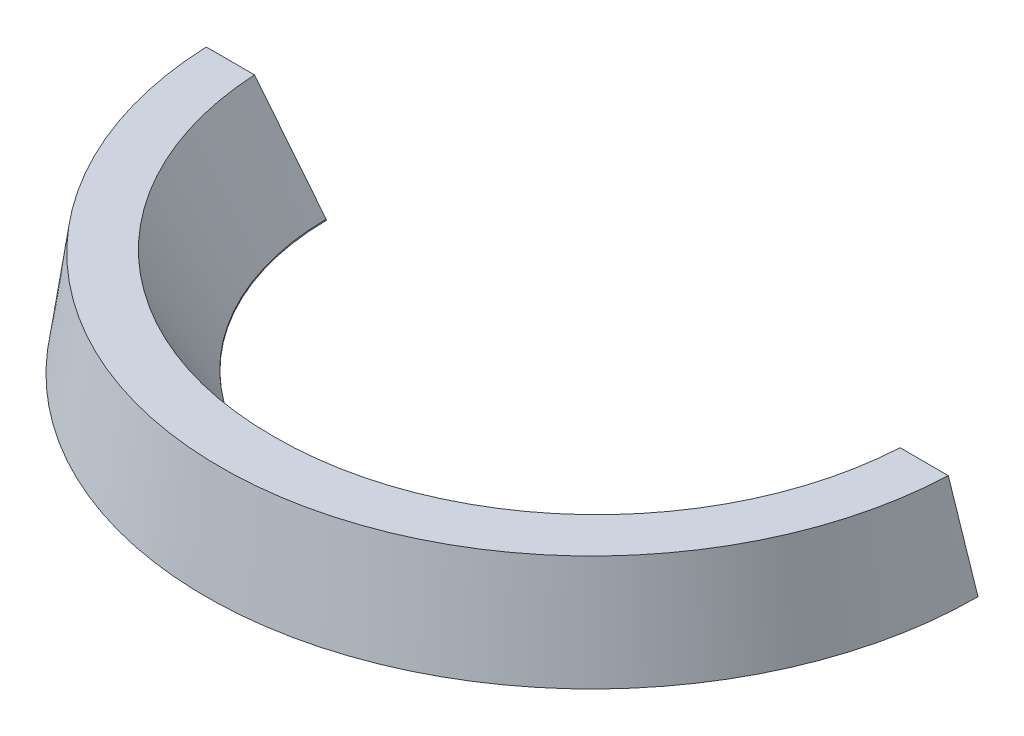
ISO-10303-21;
HEADER;
FILE_DESCRIPTION(('STEP AP214'),'2;1');
FILE_NAME('part.step','',(''),(''),'','','');
FILE_SCHEMA(('AUTOMOTIVE_DESIGN { 1 0 10303 214 1 1 1 1 }'));
ENDSEC;
DATA;
#1=APPLICATION_CONTEXT('core data for automotive mechanical design processes');
#2=APPLICATION_PROTOCOL_DEFINITION('international standard','automotive_design',2000,#1);
#3=PRODUCT_CONTEXT('',#1,'mechanical');
#4=PRODUCT('Part','Part','',(#3));
#5=PRODUCT_RELATED_PRODUCT_CATEGORY('part','',(#4));
#6=PRODUCT_DEFINITION_FORMATION('','',#4);
#7=PRODUCT_DEFINITION_CONTEXT('part definition',#1,'design');
#8=PRODUCT_DEFINITION('design','',#6,#7);
#9=PRODUCT_DEFINITION_SHAPE('','',#8);
#10=(LENGTH_UNIT() NAMED_UNIT(*) SI_UNIT(.MILLI.,.METRE.));
#11=(NAMED_UNIT(*) PLANE_ANGLE_UNIT() SI_UNIT($,.RADIAN.));
#12=(NAMED_UNIT(*) SI_UNIT($,.STERADIAN.) SOLID_ANGLE_UNIT());
#13=UNCERTAINTY_MEASURE_WITH_UNIT(LENGTH_MEASURE(1.E-05),#10,'distance_accuracy_value','');
#14=(GEOMETRIC_REPRESENTATION_CONTEXT(3) GLOBAL_UNCERTAINTY_ASSIGNED_CONTEXT((#13)) GLOBAL_UNIT_ASSIGNED_CONTEXT((#10,
#11,#12)) REPRESENTATION_CONTEXT('',''));
#15=CARTESIAN_POINT('',(0.,0.,0.));
#16=DIRECTION('',(0.,0.,1.));
#17=DIRECTION('',(1.,0.,0.));
#18=AXIS2_PLACEMENT_3D('',#15,#16,#17);
#19=CARTESIAN_POINT('',(-0.207197369265761,0.,6.66089201649253));
#20=DIRECTION('',(0.,1.,0.));
#21=DIRECTION('',(0.,0.,-1.));
#22=AXIS2_PLACEMENT_3D('',#19,#20,#21);
#23=CONICAL_SURFACE('',#22,25.1177828540698,0.139626340159546);
#24=CARTESIAN_POINT('',(-26.6794830417173,10.,8.30337877926899));
#25=CARTESIAN_POINT('',(-26.5693568794485,9.16629083982902,8.18620859799953));
#26=CARTESIAN_POINT('',(-26.4585561546402,8.33266896647467,8.06905068409214));
#27=CARTESIAN_POINT('',(-26.2355525028062,6.66561172109559,7.8347610673299));
#28=CARTESIAN_POINT('',(-26.12334957999,5.83217634851861,7.71762936439743));
#29=CARTESIAN_POINT('',(-25.8974877695671,4.16549884312783,7.48339311661011));
#30=CARTESIAN_POINT('',(-25.783828881638,3.33225671035686,7.36628857176128));
#31=CARTESIAN_POINT('',(-25.5549960349095,1.66597395239764,7.13210780210749));
#32=CARTESIAN_POINT('',(-25.4398220715637,0.83293332782174,7.01503157738859));
#33=CARTESIAN_POINT('',(-25.3238613461754,0.,6.89797043224508));
#34=B_SPLINE_CURVE_WITH_KNOTS('',3,(#24,#25,#26,#27,#28,#29,#30,#31,#32,#33),.UNSPECIFIED.,.F.,
.F.,(4,2,2,2,4),(0.,2.5472235007234,5.09443935618241,7.64165577572015,10.1888798408406),.UNSPECIFIED.);
#35=CARTESIAN_POINT('',(-25.3374065388857,0.0973193125841935,6.91164776966833));
#36=VERTEX_POINT('',#35);
#37=CARTESIAN_POINT('',(-25.3238613461754,0.,6.89797043224508));
#38=VERTEX_POINT('',#37);
#39=EDGE_CURVE('E108',#36,#38,#34,.T.);
#40=ORIENTED_EDGE('',*,*,#39,.F.);
#41=CARTESIAN_POINT('',(-0.207197369265761,0.0973193125841654,6.66089201649253));
#42=DIRECTION('',(0.,-1.,0.));
#43=DIRECTION('',(0.,0.,-1.));
#44=AXIS2_PLACEMENT_3D('',#41,#42,#43);
#45=CIRCLE('',#44,25.1314601914931);
#46=CARTESIAN_POINT('',(0.0298785111966863,0.0973193125841664,31.7912339636986));
#47=VERTEX_POINT('',#46);
#48=EDGE_CURVE('E11',#36,#47,#45,.F.);
#49=ORIENTED_EDGE('',*,*,#48,.T.);
#50=CARTESIAN_POINT('',(0.0296205345867746,10.,33.1830259572257));
#51=CARTESIAN_POINT('',(0.0296639531351228,8.33333325625877,32.9487815116451));
#52=CARTESIAN_POINT('',(0.0297073717342945,6.66666655105482,32.7145367918695));
#53=CARTESIAN_POINT('',(0.0297942090342853,3.33333321772149,32.2460468039283));
#54=CARTESIAN_POINT('',(0.0298376277351042,1.6666665895921,32.0118015357627));
#55=CARTESIAN_POINT('',(0.0298810464867468,0.,31.7775559934021));
#56=B_SPLINE_CURVE_WITH_KNOTS('',3,(#50,#51,#52,#53,#54,#55),.UNSPECIFIED.,.F.,.F.,(4,2,4),(0.,
5.04914215206601,10.098284304132),.UNSPECIFIED.);
#57=CARTESIAN_POINT('',(0.0298810464867574,0.,31.7775559934021));
#58=VERTEX_POINT('',#57);
#59=EDGE_CURVE('E131',#47,#58,#56,.T.);
#60=ORIENTED_EDGE('',*,*,#59,.T.);
#61=CARTESIAN_POINT('',(-0.207197369265761,0.,6.66089201649253));
#62=DIRECTION('',(0.,-1.,0.));
#63=DIRECTION('',(0.,0.,-1.));
#64=AXIS2_PLACEMENT_3D('',#61,#62,#63);
#65=CIRCLE('',#64,25.1177828540698);
#66=EDGE_CURVE('E126',#58,#38,#65,.T.);
#67=ORIENTED_EDGE('',*,*,#66,.T.);
#68=EDGE_LOOP('',(#40,#49,#60,#67));
#69=FACE_BOUND('',#68,.T.);
#70=ADVANCED_FACE('F47',(#69),#23,.F.);
#71=CARTESIAN_POINT('',(-36.8238613461754,0.,6.89797043224508));
#72=DIRECTION('',(0.,0.139173100960065,-0.99026806874157));
#73=DIRECTION('',(0.,0.99026806874157,0.139173100960065));
#74=AXIS2_PLACEMENT_3D('',#71,#72,#73);
#75=PLANE('',#74);
#76=DIRECTION('',(1.,0.,0.));
#77=VECTOR('',#76,1.);
#78=CARTESIAN_POINT('',(-0.207197369265761,10.,8.30337877926899));
#79=LINE('',#78,#77);
#80=CARTESIAN_POINT('',(-30.7837199399715,10.,8.30337877926899));
#81=VERTEX_POINT('',#80);
#82=CARTESIAN_POINT('',(-35.3909586414528,10.,8.30337877926899));
#83=VERTEX_POINT('',#82);
#84=EDGE_CURVE('E145',#81,#83,#79,.F.);
#85=ORIENTED_EDGE('',*,*,#84,.F.);
#86=CARTESIAN_POINT('',(-30.7837199399715,10.,8.30337877926899));
#87=CARTESIAN_POINT('',(-30.331402808772,9.17394554718539,8.1872843969608));
#88=CARTESIAN_POINT('',(-29.8787728970843,8.34805893384405,8.07121360295228));
#89=CARTESIAN_POINT('',(-28.9727831716185,6.69667952186904,7.83912736198297));
#90=CARTESIAN_POINT('',(-28.519423358597,5.87118672282824,7.72311191496496));
#91=CARTESIAN_POINT('',(-27.6118684262723,4.22065113367711,7.49114426555965));
#92=CARTESIAN_POINT('',(-27.1576733067367,3.39560834369204,7.37519206318996));
#93=CARTESIAN_POINT('',(-26.2483069805145,1.74604936133358,7.14336166691848));
#94=CARTESIAN_POINT('',(-25.7931357728153,0.921533169507615,7.02748347309362));
#95=CARTESIAN_POINT('',(-25.3374065388857,0.0973193125841938,6.91164776966833));
#96=B_SPLINE_CURVE_WITH_KNOTS('',3,(#86,#87,#88,#89,#90,#91,#92,#93,#94,#95),.UNSPECIFIED.,.F.,
.F.,(4,2,2,2,4),(0.,2.84673712850563,5.69347130759232,8.54020627867848,11.3869442043072),.UNSPECIFIED.);
#97=EDGE_CURVE('E63',#81,#36,#96,.T.);
#98=ORIENTED_EDGE('',*,*,#97,.T.);
#99=ORIENTED_EDGE('',*,*,#39,.T.);
#100=DIRECTION('',(-1.,0.,0.));
#101=VECTOR('',#100,1.);
#102=CARTESIAN_POINT('',(-36.8238613461754,0.,6.89797043224508));
#103=LINE('',#102,#101);
#104=CARTESIAN_POINT('',(-36.8238613461754,0.,6.8979704322451));
#105=VERTEX_POINT('',#104);
#106=EDGE_CURVE('E112',#38,#105,#103,.T.);
#107=ORIENTED_EDGE('',*,*,#106,.T.);
#108=CARTESIAN_POINT('',(-35.3909586414528,10.,8.30337877926899));
#109=CARTESIAN_POINT('',(-35.5127330391155,9.16700050008644,8.18630833424447));
#110=CARTESIAN_POINT('',(-35.6338930106555,8.333912971579,8.06922551760788));
#111=CARTESIAN_POINT('',(-35.8750186684569,6.66757005231801,7.83503629283452));
#112=CARTESIAN_POINT('',(-35.9949843569879,5.83431466188651,7.71792988474301));
#113=CARTESIAN_POINT('',(-36.2337564662435,4.16764113186507,7.48369419565742));
#114=CARTESIAN_POINT('',(-36.3525628870859,3.33422299229167,7.36656491466566));
#115=CARTESIAN_POINT('',(-36.5890490735365,1.66722835460747,7.13228409684111));
#116=CARTESIAN_POINT('',(-36.706728837003,0.833651856198703,7.01513255996644));
#117=CARTESIAN_POINT('',(-36.8238613461754,0.,6.89797043224508));
#118=B_SPLINE_CURVE_WITH_KNOTS('',3,(#108,#109,#110,#111,#112,#113,#114,#115,#116,#117),
.UNSPECIFIED.,.F.,.F.,(4,2,2,2,4),(0.,2.54986321031555,5.09972157428574,7.64957967926316,
10.199442630502),.UNSPECIFIED.);
#119=EDGE_CURVE('E119',#83,#105,#118,.T.);
#120=ORIENTED_EDGE('',*,*,#119,.F.);
#121=EDGE_LOOP('',(#85,#98,#99,#107,#120));
#122=FACE_BOUND('',#121,.T.);
#123=ADVANCED_FACE('F110',(#122),#75,.T.);
#124=CARTESIAN_POINT('',(0.0344909859163259,0.,6.90736986537603));
#125=DIRECTION('',(0.,-1.,0.));
#126=DIRECTION('',(0.,0.,-1.));
#127=AXIS2_PLACEMENT_3D('',#124,#125,#126);
#128=CONICAL_SURFACE('',#127,36.85835353059,0.139626340159546);
#129=CARTESIAN_POINT('',(0.0344909859163259,0.,6.90736986537603));
#130=DIRECTION('',(0.,1.,0.));
#131=DIRECTION('',(0.,0.,-1.));
#132=AXIS2_PLACEMENT_3D('',#129,#130,#131);
#133=CIRCLE('',#132,36.85835353059);
#134=CARTESIAN_POINT('',(36.892843318008,0.,6.91676929850697));
#135=VERTEX_POINT('',#134);
#136=EDGE_CURVE('E128',#105,#135,#133,.T.);
#137=ORIENTED_EDGE('',*,*,#136,.T.);
#138=CARTESIAN_POINT('',(35.4592415650571,10.,8.32100652116917));
#139=CARTESIAN_POINT('',(35.5810726959632,9.16700018600238,8.20403555792587));
#140=CARTESIAN_POINT('',(35.7022898028325,8.33391242764337,8.08705173310077));
#141=CARTESIAN_POINT('',(35.9435305023908,6.66756920689623,7.85305953879346));
#142=CARTESIAN_POINT('',(36.063554097345,5.83431374482945,7.73605116935825));
#143=CARTESIAN_POINT('',(36.3024427571244,4.16764022332065,7.50201063211464));
#144=CARTESIAN_POINT('',(36.421307822067,3.33422216389513,7.38497846430866));
#145=CARTESIAN_POINT('',(36.6579120039943,1.66722783293565,7.15089097326014));
#146=CARTESIAN_POINT('',(36.7756511188414,0.83365156110436,7.03383564997407));
#147=CARTESIAN_POINT('',(36.892843318008,0.,6.91676929850697));
#148=B_SPLINE_CURVE_WITH_KNOTS('',3,(#138,#139,#140,#141,#142,#143,#144,#145,#146,#147),
.UNSPECIFIED.,.F.,.F.,(4,2,2,2,4),(0.,2.54984743502126,5.09969002973804,7.64953236580653,
10.1993795420957),.UNSPECIFIED.);
#149=CARTESIAN_POINT('',(35.4592415650571,10.,8.32100652116917));
#150=VERTEX_POINT('',#149);
#151=EDGE_CURVE('E180',#150,#135,#148,.T.);
#152=ORIENTED_EDGE('',*,*,#151,.F.);
#153=CARTESIAN_POINT('',(0.0344909859163259,10.,6.90736986537603));
#154=DIRECTION('',(0.,-1.,0.));
#155=DIRECTION('',(0.,0.,-1.));
#156=AXIS2_PLACEMENT_3D('',#153,#154,#155);
#157=CIRCLE('',#156,35.452945183566);
#158=EDGE_CURVE('E232',#83,#150,#157,.F.);
#159=ORIENTED_EDGE('',*,*,#158,.F.);
#160=ORIENTED_EDGE('',*,*,#119,.T.);
#161=EDGE_LOOP('',(#137,#152,#159,#160));
#162=FACE_BOUND('',#161,.T.);
#163=ADVANCED_FACE('F193',(#162),#128,.T.);
#164=CARTESIAN_POINT('',(36.892843318008,0.,6.91676929850697));
#165=DIRECTION('',(0.000809284324008064,0.139173100960065,-0.990267738052716));
#166=DIRECTION('',(0.,0.990268062336404,0.139173146535181));
#167=AXIS2_PLACEMENT_3D('',#164,#165,#166);
#168=PLANE('',#167);
#169=CARTESIAN_POINT('',(26.7479076487407,10.,8.31388728895674));
#170=CARTESIAN_POINT('',(26.6378304612348,9.16629036506826,8.19662704258705));
#171=CARTESIAN_POINT('',(26.5270781558723,8.33266812455376,8.07937852697392));
#172=CARTESIAN_POINT('',(26.3041701665215,6.66561037986775,7.84490659294372));
#173=CARTESIAN_POINT('',(26.1920144867534,5.83217487514237,7.72768317445228));
#174=CARTESIAN_POINT('',(25.9662459193953,4.16549735153731,7.49326233925526));
#175=CARTESIAN_POINT('',(25.852633031482,3.3322553327006,7.37606492255547));
#176=CARTESIAN_POINT('',(25.6238908662319,1.66597306283945,7.14169720653121));
#177=CARTESIAN_POINT('',(25.508761584337,0.832932812429168,7.02452690728932));
#178=CARTESIAN_POINT('',(25.3928448437741,0.,6.90737106393496));
#179=B_SPLINE_CURVE_WITH_KNOTS('',3,(#169,#170,#171,#172,#173,#174,#175,#176,#177,#178),
.UNSPECIFIED.,.F.,.F.,(4,2,2,2,4),(0.,2.54724314754402,5.09447863691707,7.64171469138104,
10.1889584043351),.UNSPECIFIED.);
#180=CARTESIAN_POINT('',(25.4063849026003,0.0973193125841938,6.9210594713748));
#181=VERTEX_POINT('',#180);
#182=CARTESIAN_POINT('',(25.3928448437741,0.,6.90737106393496));
#183=VERTEX_POINT('',#182);
#184=EDGE_CURVE('E173',#181,#183,#179,.T.);
#185=ORIENTED_EDGE('',*,*,#184,.F.);
#186=CARTESIAN_POINT('',(25.4063849026003,0.0973193125841949,6.9210594713748));
#187=CARTESIAN_POINT('',(25.8620669482081,0.921529449585424,7.03726709131778));
#188=CARTESIAN_POINT('',(26.3171889275242,1.74604304023408,7.15351690119651));
#189=CARTESIAN_POINT('',(27.226453230033,3.39559876025624,7.38609000164022));
#190=CARTESIAN_POINT('',(27.6805955542494,4.22064088907636,7.50241329212826));
#191=CARTESIAN_POINT('',(28.5880418479661,5.87117680908566,7.73512266499666));
#192=CARTESIAN_POINT('',(29.0413458177012,6.69667060014823,7.85150874735941));
#193=CARTESIAN_POINT('',(29.9472211969979,8.34805344296467,8.084335863695));
#194=CARTESIAN_POINT('',(30.3997926057945,9.1739424951301,8.20077689772506));
#195=CARTESIAN_POINT('',(30.8520500947216,10.,8.3172413496995));
#196=B_SPLINE_CURVE_WITH_KNOTS('',3,(#186,#187,#188,#189,#190,#191,#192,#193,#194,#195),
.UNSPECIFIED.,.F.,.F.,(4,2,2,2,4),(0.,2.84679666342125,5.69359035100013,8.54038324086201,
11.3871791014051),.UNSPECIFIED.);
#197=CARTESIAN_POINT('',(30.8520500947216,10.,8.3172413496995));
#198=VERTEX_POINT('',#197);
#199=EDGE_CURVE('E213',#181,#198,#196,.T.);
#200=ORIENTED_EDGE('',*,*,#199,.T.);
#201=DIRECTION('',(0.999999666061277,0.,0.000817237624390434));
#202=VECTOR('',#201,1.);
#203=CARTESIAN_POINT('',(-0.208530256040548,10.,8.29185746632479));
#204=LINE('',#203,#202);
#205=EDGE_CURVE('E228',#150,#198,#204,.F.);
#206=ORIENTED_EDGE('',*,*,#205,.F.);
#207=ORIENTED_EDGE('',*,*,#151,.T.);
#208=DIRECTION('',(-0.999999666061277,0.,-0.000817237624390434));
#209=VECTOR('',#208,1.);
#210=CARTESIAN_POINT('',(36.892843318008,0.,6.91676929850697));
#211=LINE('',#210,#209);
#212=EDGE_CURVE('E139',#135,#183,#211,.T.);
#213=ORIENTED_EDGE('',*,*,#212,.T.);
#214=EDGE_LOOP('',(#185,#200,#206,#207,#213));
#215=FACE_BOUND('',#214,.T.);
#216=ADVANCED_FACE('F169',(#215),#168,.T.);
#217=CARTESIAN_POINT('',(0.276270480396834,0.,6.66098163002486));
#218=DIRECTION('',(0.,1.,0.));
#219=DIRECTION('',(0.,0.,-1.));
#220=AXIS2_PLACEMENT_3D('',#217,#218,#219);
#221=CONICAL_SURFACE('',#220,25.1177828540698,0.139626340159546);
#222=ORIENTED_EDGE('',*,*,#59,.F.);
#223=CARTESIAN_POINT('',(0.276270480396834,0.0973193125841654,6.66098163002486));
#224=DIRECTION('',(0.,-1.,0.));
#225=DIRECTION('',(0.,0.,-1.));
#226=AXIS2_PLACEMENT_3D('',#223,#224,#225);
#227=CIRCLE('',#226,25.131460191493);
#228=EDGE_CURVE('E77',#47,#181,#227,.F.);
#229=ORIENTED_EDGE('',*,*,#228,.T.);
#230=ORIENTED_EDGE('',*,*,#184,.T.);
#231=CARTESIAN_POINT('',(0.276270480396834,0.,6.66098163002486));
#232=DIRECTION('',(0.,-1.,0.));
#233=DIRECTION('',(0.,0.,-1.));
#234=AXIS2_PLACEMENT_3D('',#231,#232,#233);
#235=CIRCLE('',#234,25.1177828540698);
#236=EDGE_CURVE('E143',#183,#58,#235,.T.);
#237=ORIENTED_EDGE('',*,*,#236,.T.);
#238=EDGE_LOOP('',(#222,#229,#230,#237));
#239=FACE_BOUND('',#238,.T.);
#240=ADVANCED_FACE('F163',(#239),#221,.F.);
#241=CARTESIAN_POINT('',(-0.207197369265761,10.,6.66089201649253));
#242=DIRECTION('',(0.,-1.,0.));
#243=DIRECTION('',(0.,0.,-1.));
#244=AXIS2_PLACEMENT_3D('',#241,#242,#243);
#245=PLANE('',#244);
#246=ORIENTED_EDGE('',*,*,#205,.T.);
#247=CARTESIAN_POINT('',(0.276270480396834,10.,6.66098163002486));
#248=DIRECTION('',(0.,-1.,0.));
#249=DIRECTION('',(0.,0.,-1.));
#250=AXIS2_PLACEMENT_3D('',#247,#248,#249);
#251=CIRCLE('',#250,30.6206057301741);
#252=CARTESIAN_POINT('',(0.0288610280478413,10.,37.280587830067));
#253=VERTEX_POINT('',#252);
#254=EDGE_CURVE('E222',#198,#253,#251,.T.);
#255=ORIENTED_EDGE('',*,*,#254,.T.);
#256=CARTESIAN_POINT('',(-0.207197369265761,10.,6.66089201649253));
#257=DIRECTION('',(0.,-1.,0.));
#258=DIRECTION('',(0.,0.,-1.));
#259=AXIS2_PLACEMENT_3D('',#256,#257,#258);
#260=CIRCLE('',#259,30.6206057301742);
#261=EDGE_CURVE('E118',#253,#81,#260,.T.);
#262=ORIENTED_EDGE('',*,*,#261,.T.);
#263=ORIENTED_EDGE('',*,*,#84,.T.);
#264=ORIENTED_EDGE('',*,*,#158,.T.);
#265=EDGE_LOOP('',(#246,#255,#262,#263,#264));
#266=FACE_BOUND('',#265,.T.);
#267=ADVANCED_FACE('F168',(#266),#245,.F.);
#268=CARTESIAN_POINT('',(-0.207197369265761,0.,6.66089201649253));
#269=DIRECTION('',(0.,-1.,0.));
#270=DIRECTION('',(0.,0.,-1.));
#271=AXIS2_PLACEMENT_3D('',#268,#269,#270);
#272=PLANE('',#271);
#273=ORIENTED_EDGE('',*,*,#66,.F.);
#274=ORIENTED_EDGE('',*,*,#236,.F.);
#275=ORIENTED_EDGE('',*,*,#212,.F.);
#276=ORIENTED_EDGE('',*,*,#136,.F.);
#277=ORIENTED_EDGE('',*,*,#106,.F.);
#278=EDGE_LOOP('',(#273,#274,#275,#276,#277));
#279=FACE_BOUND('',#278,.T.);
#280=ADVANCED_FACE('F124',(#279),#272,.T.);
#281=CARTESIAN_POINT('',(-0.207197369265761,10.,6.66089201649253));
#282=DIRECTION('',(0.,1.,0.));
#283=DIRECTION('',(0.,0.,1.));
#284=AXIS2_PLACEMENT_3D('',#281,#282,#283);
#285=CONICAL_SURFACE('',#284,30.6206057301742,0.506145483078353);
#286=ORIENTED_EDGE('',*,*,#97,.F.);
#287=ORIENTED_EDGE('',*,*,#261,.F.);
#288=CARTESIAN_POINT('',(0.0288610280478413,10.,37.280587830067));
#289=CARTESIAN_POINT('',(0.0290306076027481,8.34955031815021,36.3657007516537));
#290=CARTESIAN_POINT('',(0.0292001876426055,6.69910208660753,35.4508110569164));
#291=CARTESIAN_POINT('',(0.0295393486922215,3.39820852413559,33.6210264347936));
#292=CARTESIAN_POINT('',(0.0297089297019802,1.74776319320632,32.706131507408));
#293=CARTESIAN_POINT('',(0.0298785111966895,0.0973193125841723,31.7912339636986));
#294=B_SPLINE_CURVE_WITH_KNOTS('',3,(#288,#289,#290,#291,#292,#293),.UNSPECIFIED.,.F.,.F.,(4,2,
4),(0.,5.66118564663497,11.3223712932728),.UNSPECIFIED.);
#295=EDGE_CURVE('E53',#47,#253,#294,.F.);
#296=ORIENTED_EDGE('',*,*,#295,.F.);
#297=ORIENTED_EDGE('',*,*,#48,.F.);
#298=EDGE_LOOP('',(#286,#287,#296,#297));
#299=FACE_BOUND('',#298,.T.);
#300=ADVANCED_FACE('F198',(#299),#285,.F.);
#301=CARTESIAN_POINT('',(0.276270480396834,10.,6.66098163002486));
#302=DIRECTION('',(0.,1.,0.));
#303=DIRECTION('',(0.,0.,1.));
#304=AXIS2_PLACEMENT_3D('',#301,#302,#303);
#305=CONICAL_SURFACE('',#304,30.6206057301741,0.506145483078353);
#306=ORIENTED_EDGE('',*,*,#199,.F.);
#307=ORIENTED_EDGE('',*,*,#228,.F.);
#308=ORIENTED_EDGE('',*,*,#295,.T.);
#309=ORIENTED_EDGE('',*,*,#254,.F.);
#310=EDGE_LOOP('',(#306,#307,#308,#309));
#311=FACE_BOUND('',#310,.T.);
#312=ADVANCED_FACE('F50',(#311),#305,.F.);
#313=CLOSED_SHELL('',(#70,#123,#163,#216,#240,#267,#280,#300,#312));
#314=MANIFOLD_SOLID_BREP('B2',#313);
#315=ADVANCED_BREP_SHAPE_REPRESENTATION('',(#18,#314),#14);
#316=SHAPE_DEFINITION_REPRESENTATION(#9,#315);
ENDSEC;
END-ISO-10303-21;
